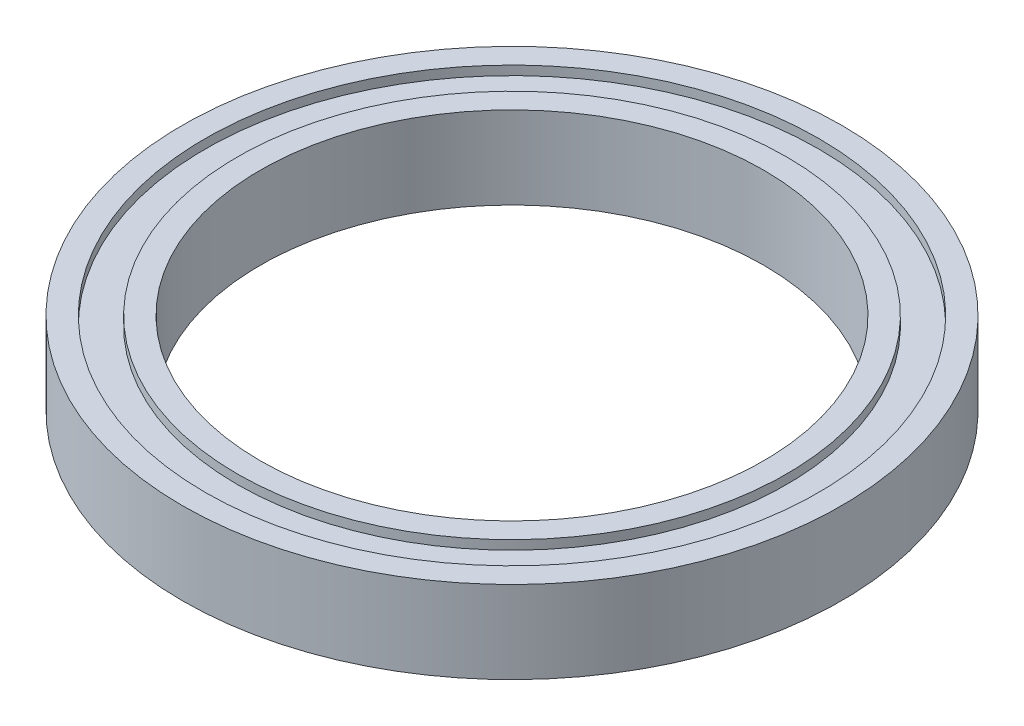
ISO-10303-21;
HEADER;
FILE_DESCRIPTION(('STEP AP214'),'2;1');
FILE_NAME('part.step','',(''),(''),'','','');
FILE_SCHEMA(('AUTOMOTIVE_DESIGN { 1 0 10303 214 1 1 1 1 }'));
ENDSEC;
DATA;
#1=APPLICATION_CONTEXT('core data for automotive mechanical design processes');
#2=APPLICATION_PROTOCOL_DEFINITION('international standard','automotive_design',2000,#1);
#3=PRODUCT_CONTEXT('',#1,'mechanical');
#4=PRODUCT('Part','Part','',(#3));
#5=PRODUCT_RELATED_PRODUCT_CATEGORY('part','',(#4));
#6=PRODUCT_DEFINITION_FORMATION('','',#4);
#7=PRODUCT_DEFINITION_CONTEXT('part definition',#1,'design');
#8=PRODUCT_DEFINITION('design','',#6,#7);
#9=PRODUCT_DEFINITION_SHAPE('','',#8);
#10=(LENGTH_UNIT() NAMED_UNIT(*) SI_UNIT(.MILLI.,.METRE.));
#11=(NAMED_UNIT(*) PLANE_ANGLE_UNIT() SI_UNIT($,.RADIAN.));
#12=(NAMED_UNIT(*) SI_UNIT($,.STERADIAN.) SOLID_ANGLE_UNIT());
#13=UNCERTAINTY_MEASURE_WITH_UNIT(LENGTH_MEASURE(1.E-05),#10,'distance_accuracy_value','');
#14=(GEOMETRIC_REPRESENTATION_CONTEXT(3) GLOBAL_UNCERTAINTY_ASSIGNED_CONTEXT((#13)) GLOBAL_UNIT_ASSIGNED_CONTEXT((#10,
#11,#12)) REPRESENTATION_CONTEXT('',''));
#15=CARTESIAN_POINT('',(0.,0.,0.));
#16=DIRECTION('',(0.,0.,1.));
#17=DIRECTION('',(1.,0.,0.));
#18=AXIS2_PLACEMENT_3D('',#15,#16,#17);
#19=CARTESIAN_POINT('',(0.,0.,0.));
#20=DIRECTION('',(0.,1.,0.));
#21=DIRECTION('',(0.,0.,1.));
#22=AXIS2_PLACEMENT_3D('',#19,#20,#21);
#23=PLANE('',#22);
#24=CARTESIAN_POINT('',(0.,0.,0.));
#25=DIRECTION('',(0.,1.,0.));
#26=DIRECTION('',(0.,0.,1.));
#27=AXIS2_PLACEMENT_3D('',#24,#25,#26);
#28=CIRCLE('',#27,27.5);
#29=CARTESIAN_POINT('',(0.,0.,27.5));
#30=VERTEX_POINT('',#29);
#31=EDGE_CURVE('E59',#30,#30,#28,.T.);
#32=ORIENTED_EDGE('',*,*,#31,.T.);
#33=EDGE_LOOP('',(#32));
#34=FACE_BOUND('',#33,.T.);
#35=CARTESIAN_POINT('',(0.,0.,0.));
#36=DIRECTION('',(0.,1.,0.));
#37=DIRECTION('',(0.,0.,1.));
#38=AXIS2_PLACEMENT_3D('',#35,#36,#37);
#39=CIRCLE('',#38,30.);
#40=CARTESIAN_POINT('',(0.,0.,30.));
#41=VERTEX_POINT('',#40);
#42=EDGE_CURVE('E81',#41,#41,#39,.T.);
#43=ORIENTED_EDGE('',*,*,#42,.F.);
#44=EDGE_LOOP('',(#43));
#45=FACE_BOUND('',#44,.T.);
#46=ADVANCED_FACE('F46',(#34,#45),#23,.F.);
#47=CARTESIAN_POINT('',(0.,9.,0.));
#48=DIRECTION('',(0.,1.,0.));
#49=DIRECTION('',(0.,0.,1.));
#50=AXIS2_PLACEMENT_3D('',#47,#48,#49);
#51=PLANE('',#50);
#52=CARTESIAN_POINT('',(0.,9.,0.));
#53=DIRECTION('',(0.,1.,0.));
#54=DIRECTION('',(0.,0.,1.));
#55=AXIS2_PLACEMENT_3D('',#52,#53,#54);
#56=CIRCLE('',#55,27.5);
#57=CARTESIAN_POINT('',(0.,9.,27.5));
#58=VERTEX_POINT('',#57);
#59=EDGE_CURVE('E57',#58,#58,#56,.T.);
#60=ORIENTED_EDGE('',*,*,#59,.F.);
#61=EDGE_LOOP('',(#60));
#62=FACE_BOUND('',#61,.T.);
#63=CARTESIAN_POINT('',(0.,9.,0.));
#64=DIRECTION('',(0.,1.,0.));
#65=DIRECTION('',(0.,0.,1.));
#66=AXIS2_PLACEMENT_3D('',#63,#64,#65);
#67=CIRCLE('',#66,30.);
#68=CARTESIAN_POINT('',(0.,9.,30.));
#69=VERTEX_POINT('',#68);
#70=EDGE_CURVE('E69',#69,#69,#67,.T.);
#71=ORIENTED_EDGE('',*,*,#70,.T.);
#72=EDGE_LOOP('',(#71));
#73=FACE_BOUND('',#72,.T.);
#74=ADVANCED_FACE('F101',(#62,#73),#51,.T.);
#75=CARTESIAN_POINT('',(0.,9.,0.));
#76=DIRECTION('',(0.,1.,0.));
#77=DIRECTION('',(0.,0.,1.));
#78=AXIS2_PLACEMENT_3D('',#75,#76,#77);
#79=CIRCLE('',#78,33.5);
#80=CARTESIAN_POINT('',(0.,9.,33.5));
#81=VERTEX_POINT('',#80);
#82=EDGE_CURVE('E65',#81,#81,#79,.T.);
#83=ORIENTED_EDGE('',*,*,#82,.F.);
#84=EDGE_LOOP('',(#83));
#85=FACE_BOUND('',#84,.T.);
#86=CARTESIAN_POINT('',(0.,9.,0.));
#87=DIRECTION('',(0.,1.,0.));
#88=DIRECTION('',(0.,0.,1.));
#89=AXIS2_PLACEMENT_3D('',#86,#87,#88);
#90=CIRCLE('',#89,36.);
#91=CARTESIAN_POINT('',(0.,9.,36.));
#92=VERTEX_POINT('',#91);
#93=EDGE_CURVE('E12',#92,#92,#90,.T.);
#94=ORIENTED_EDGE('',*,*,#93,.T.);
#95=EDGE_LOOP('',(#94));
#96=FACE_BOUND('',#95,.T.);
#97=ADVANCED_FACE('F107',(#85,#96),#51,.T.);
#98=CARTESIAN_POINT('',(0.,0.,0.));
#99=DIRECTION('',(0.,1.,0.));
#100=DIRECTION('',(0.,0.,1.));
#101=AXIS2_PLACEMENT_3D('',#98,#99,#100);
#102=CIRCLE('',#101,33.5);
#103=CARTESIAN_POINT('',(0.,0.,33.5));
#104=VERTEX_POINT('',#103);
#105=EDGE_CURVE('E77',#104,#104,#102,.T.);
#106=ORIENTED_EDGE('',*,*,#105,.T.);
#107=EDGE_LOOP('',(#106));
#108=FACE_BOUND('',#107,.T.);
#109=CARTESIAN_POINT('',(0.,0.,0.));
#110=DIRECTION('',(0.,1.,0.));
#111=DIRECTION('',(0.,0.,1.));
#112=AXIS2_PLACEMENT_3D('',#109,#110,#111);
#113=CIRCLE('',#112,36.);
#114=CARTESIAN_POINT('',(0.,0.,36.));
#115=VERTEX_POINT('',#114);
#116=EDGE_CURVE('E50',#115,#115,#113,.T.);
#117=ORIENTED_EDGE('',*,*,#116,.F.);
#118=EDGE_LOOP('',(#117));
#119=FACE_BOUND('',#118,.T.);
#120=ADVANCED_FACE('F103',(#108,#119),#23,.F.);
#121=CARTESIAN_POINT('',(0.,9.,0.));
#122=DIRECTION('',(0.,-1.,0.));
#123=DIRECTION('',(0.,0.,-1.));
#124=AXIS2_PLACEMENT_3D('',#121,#122,#123);
#125=CYLINDRICAL_SURFACE('',#124,36.);
#126=ORIENTED_EDGE('',*,*,#93,.F.);
#127=EDGE_LOOP('',(#126));
#128=FACE_BOUND('',#127,.T.);
#129=ORIENTED_EDGE('',*,*,#116,.T.);
#130=EDGE_LOOP('',(#129));
#131=FACE_BOUND('',#130,.T.);
#132=ADVANCED_FACE('F48',(#128,#131),#125,.T.);
#133=CARTESIAN_POINT('',(0.,9.,0.));
#134=DIRECTION('',(0.,-1.,0.));
#135=DIRECTION('',(0.,0.,-1.));
#136=AXIS2_PLACEMENT_3D('',#133,#134,#135);
#137=CYLINDRICAL_SURFACE('',#136,27.5);
#138=ORIENTED_EDGE('',*,*,#59,.T.);
#139=EDGE_LOOP('',(#138));
#140=FACE_BOUND('',#139,.T.);
#141=ORIENTED_EDGE('',*,*,#31,.F.);
#142=EDGE_LOOP('',(#141));
#143=FACE_BOUND('',#142,.T.);
#144=ADVANCED_FACE('F116',(#140,#143),#137,.F.);
#145=CARTESIAN_POINT('',(0.,8.,0.));
#146=DIRECTION('',(0.,1.,0.));
#147=DIRECTION('',(0.,0.,1.));
#148=AXIS2_PLACEMENT_3D('',#145,#146,#147);
#149=CYLINDRICAL_SURFACE('',#148,30.);
#150=CARTESIAN_POINT('',(0.,8.,0.));
#151=DIRECTION('',(0.,1.,0.));
#152=DIRECTION('',(0.,0.,1.));
#153=AXIS2_PLACEMENT_3D('',#150,#151,#152);
#154=CIRCLE('',#153,30.);
#155=CARTESIAN_POINT('',(0.,8.,30.));
#156=VERTEX_POINT('',#155);
#157=EDGE_CURVE('E68',#156,#156,#154,.T.);
#158=ORIENTED_EDGE('',*,*,#157,.T.);
#159=EDGE_LOOP('',(#158));
#160=FACE_BOUND('',#159,.T.);
#161=ORIENTED_EDGE('',*,*,#70,.F.);
#162=EDGE_LOOP('',(#161));
#163=FACE_BOUND('',#162,.T.);
#164=ADVANCED_FACE('F138',(#160,#163),#149,.T.);
#165=CARTESIAN_POINT('',(0.,8.,0.));
#166=DIRECTION('',(0.,1.,0.));
#167=DIRECTION('',(0.,0.,1.));
#168=AXIS2_PLACEMENT_3D('',#165,#166,#167);
#169=CYLINDRICAL_SURFACE('',#168,33.5);
#170=CARTESIAN_POINT('',(0.,8.,0.));
#171=DIRECTION('',(0.,1.,0.));
#172=DIRECTION('',(0.,0.,1.));
#173=AXIS2_PLACEMENT_3D('',#170,#171,#172);
#174=CIRCLE('',#173,33.5);
#175=CARTESIAN_POINT('',(0.,8.,33.5));
#176=VERTEX_POINT('',#175);
#177=EDGE_CURVE('E62',#176,#176,#174,.T.);
#178=ORIENTED_EDGE('',*,*,#177,.F.);
#179=EDGE_LOOP('',(#178));
#180=FACE_BOUND('',#179,.T.);
#181=ORIENTED_EDGE('',*,*,#82,.T.);
#182=EDGE_LOOP('',(#181));
#183=FACE_BOUND('',#182,.T.);
#184=ADVANCED_FACE('F134',(#180,#183),#169,.F.);
#185=CARTESIAN_POINT('',(0.,8.,0.));
#186=DIRECTION('',(0.,1.,0.));
#187=DIRECTION('',(0.,0.,1.));
#188=AXIS2_PLACEMENT_3D('',#185,#186,#187);
#189=PLANE('',#188);
#190=ORIENTED_EDGE('',*,*,#157,.F.);
#191=EDGE_LOOP('',(#190));
#192=FACE_BOUND('',#191,.T.);
#193=ORIENTED_EDGE('',*,*,#177,.T.);
#194=EDGE_LOOP('',(#193));
#195=FACE_BOUND('',#194,.T.);
#196=ADVANCED_FACE('F96',(#192,#195),#189,.T.);
#197=CARTESIAN_POINT('',(0.,0.999999999999997,0.));
#198=DIRECTION('',(0.,-1.,0.));
#199=DIRECTION('',(0.,0.,-1.));
#200=AXIS2_PLACEMENT_3D('',#197,#198,#199);
#201=CYLINDRICAL_SURFACE('',#200,30.);
#202=CARTESIAN_POINT('',(0.,0.999999999999997,0.));
#203=DIRECTION('',(0.,1.,0.));
#204=DIRECTION('',(0.,0.,1.));
#205=AXIS2_PLACEMENT_3D('',#202,#203,#204);
#206=CIRCLE('',#205,30.);
#207=CARTESIAN_POINT('',(0.,0.999999999999997,30.));
#208=VERTEX_POINT('',#207);
#209=EDGE_CURVE('E80',#208,#208,#206,.T.);
#210=ORIENTED_EDGE('',*,*,#209,.F.);
#211=EDGE_LOOP('',(#210));
#212=FACE_BOUND('',#211,.T.);
#213=ORIENTED_EDGE('',*,*,#42,.T.);
#214=EDGE_LOOP('',(#213));
#215=FACE_BOUND('',#214,.T.);
#216=ADVANCED_FACE('F92',(#212,#215),#201,.T.);
#217=CARTESIAN_POINT('',(0.,0.999999999999997,0.));
#218=DIRECTION('',(0.,-1.,0.));
#219=DIRECTION('',(0.,0.,-1.));
#220=AXIS2_PLACEMENT_3D('',#217,#218,#219);
#221=CYLINDRICAL_SURFACE('',#220,33.5);
#222=CARTESIAN_POINT('',(0.,0.999999999999997,0.));
#223=DIRECTION('',(0.,1.,0.));
#224=DIRECTION('',(0.,0.,1.));
#225=AXIS2_PLACEMENT_3D('',#222,#223,#224);
#226=CIRCLE('',#225,33.5);
#227=CARTESIAN_POINT('',(0.,0.999999999999997,33.5));
#228=VERTEX_POINT('',#227);
#229=EDGE_CURVE('E72',#228,#228,#226,.T.);
#230=ORIENTED_EDGE('',*,*,#229,.T.);
#231=EDGE_LOOP('',(#230));
#232=FACE_BOUND('',#231,.T.);
#233=ORIENTED_EDGE('',*,*,#105,.F.);
#234=EDGE_LOOP('',(#233));
#235=FACE_BOUND('',#234,.T.);
#236=ADVANCED_FACE('F95',(#232,#235),#221,.F.);
#237=CARTESIAN_POINT('',(0.,0.999999999999997,0.));
#238=DIRECTION('',(0.,-1.,0.));
#239=DIRECTION('',(0.,0.,1.));
#240=AXIS2_PLACEMENT_3D('',#237,#238,#239);
#241=PLANE('',#240);
#242=ORIENTED_EDGE('',*,*,#209,.T.);
#243=EDGE_LOOP('',(#242));
#244=FACE_BOUND('',#243,.T.);
#245=ORIENTED_EDGE('',*,*,#229,.F.);
#246=EDGE_LOOP('',(#245));
#247=FACE_BOUND('',#246,.T.);
#248=ADVANCED_FACE('F89',(#244,#247),#241,.T.);
#249=CLOSED_SHELL('',(#46,#74,#97,#120,#132,#144,#164,#184,#196,#216,#236,#248));
#250=MANIFOLD_SOLID_BREP('B2',#249);
#251=ADVANCED_BREP_SHAPE_REPRESENTATION('',(#18,#250),#14);
#252=SHAPE_DEFINITION_REPRESENTATION(#9,#251);
ENDSEC;
END-ISO-10303-21;
